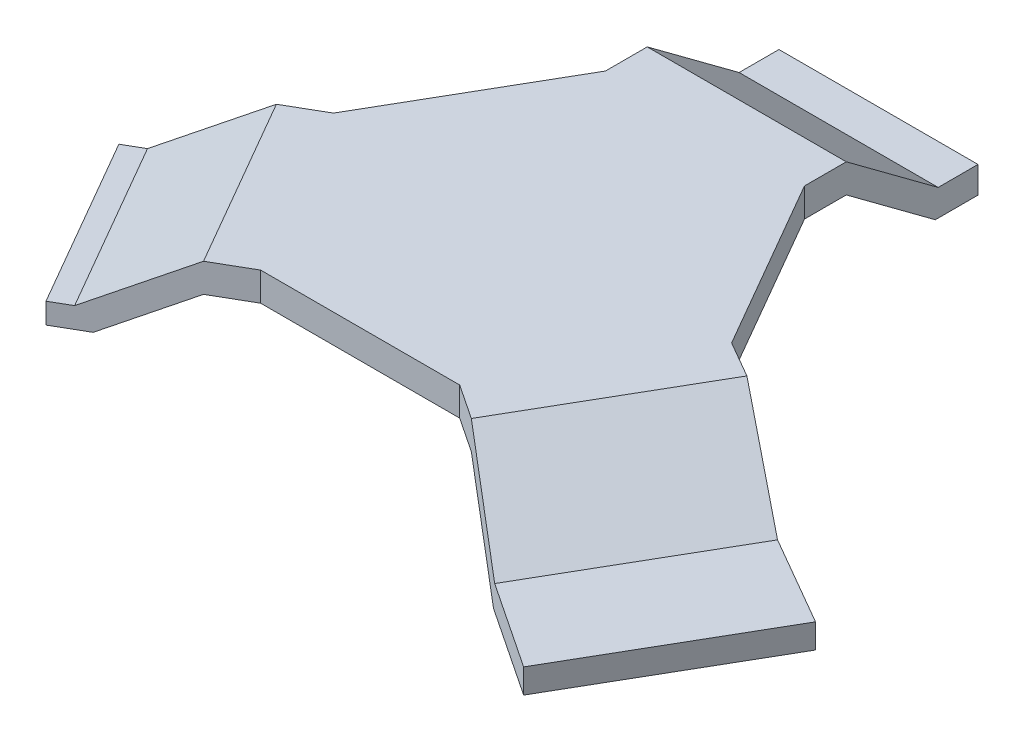
ISO-10303-21;
HEADER;
FILE_DESCRIPTION(('STEP AP214'),'2;1');
FILE_NAME('part.step','',(''),(''),'','','');
FILE_SCHEMA(('AUTOMOTIVE_DESIGN { 1 0 10303 214 1 1 1 1 }'));
ENDSEC;
DATA;
#1=APPLICATION_CONTEXT('core data for automotive mechanical design processes');
#2=APPLICATION_PROTOCOL_DEFINITION('international standard','automotive_design',2000,#1);
#3=PRODUCT_CONTEXT('',#1,'mechanical');
#4=PRODUCT('Part','Part','',(#3));
#5=PRODUCT_RELATED_PRODUCT_CATEGORY('part','',(#4));
#6=PRODUCT_DEFINITION_FORMATION('','',#4);
#7=PRODUCT_DEFINITION_CONTEXT('part definition',#1,'design');
#8=PRODUCT_DEFINITION('design','',#6,#7);
#9=PRODUCT_DEFINITION_SHAPE('','',#8);
#10=(LENGTH_UNIT() NAMED_UNIT(*) SI_UNIT(.MILLI.,.METRE.));
#11=(NAMED_UNIT(*) PLANE_ANGLE_UNIT() SI_UNIT($,.RADIAN.));
#12=(NAMED_UNIT(*) SI_UNIT($,.STERADIAN.) SOLID_ANGLE_UNIT());
#13=UNCERTAINTY_MEASURE_WITH_UNIT(LENGTH_MEASURE(1.E-05),#10,'distance_accuracy_value','');
#14=(GEOMETRIC_REPRESENTATION_CONTEXT(3) GLOBAL_UNCERTAINTY_ASSIGNED_CONTEXT((#13)) GLOBAL_UNIT_ASSIGNED_CONTEXT((#10,
#11,#12)) REPRESENTATION_CONTEXT('',''));
#15=CARTESIAN_POINT('',(0.,0.,0.));
#16=DIRECTION('',(0.,0.,1.));
#17=DIRECTION('',(1.,0.,0.));
#18=AXIS2_PLACEMENT_3D('',#15,#16,#17);
#19=CARTESIAN_POINT('',(69.3496378300734,10.,0.));
#20=DIRECTION('',(-0.500366239620644,0.,0.865813851961203));
#21=DIRECTION('',(0.865813851961203,0.,0.500366239620644));
#22=AXIS2_PLACEMENT_3D('',#19,#20,#21);
#23=PLANE('',#22);
#24=DIRECTION('',(-0.865813851961203,0.,-0.500366239620644));
#25=VECTOR('',#24,1.);
#26=CARTESIAN_POINT('',(69.3496378300734,0.,0.));
#27=LINE('',#26,#25);
#28=CARTESIAN_POINT('',(81.9647254608758,0.,7.29044002473675));
#29=VERTEX_POINT('',#28);
#30=CARTESIAN_POINT('',(69.3496378300734,0.,0.));
#31=VERTEX_POINT('',#30);
#32=EDGE_CURVE('E170',#29,#31,#27,.T.);
#33=ORIENTED_EDGE('',*,*,#32,.T.);
#34=DIRECTION('',(0.,-1.,0.));
#35=VECTOR('',#34,1.);
#36=CARTESIAN_POINT('',(69.3496378300734,10.,0.));
#37=LINE('',#36,#35);
#38=CARTESIAN_POINT('',(69.3496378300734,10.,0.));
#39=VERTEX_POINT('',#38);
#40=EDGE_CURVE('E11',#39,#31,#37,.T.);
#41=ORIENTED_EDGE('',*,*,#40,.F.);
#42=DIRECTION('',(-0.865813851961203,0.,-0.500366239620644));
#43=VECTOR('',#42,1.);
#44=CARTESIAN_POINT('',(69.3496378300734,10.,0.));
#45=LINE('',#44,#43);
#46=CARTESIAN_POINT('',(81.9647254608758,10.,7.29044002473675));
#47=VERTEX_POINT('',#46);
#48=EDGE_CURVE('E111',#47,#39,#45,.T.);
#49=ORIENTED_EDGE('',*,*,#48,.F.);
#50=DIRECTION('',(0.60896200313436,-0.710853044408382,0.351927873283608));
#51=VECTOR('',#50,1.);
#52=CARTESIAN_POINT('',(81.9647254608758,10.,7.29044002473675));
#53=LINE('',#52,#51);
#54=CARTESIAN_POINT('',(107.250161795656,-19.516175566387,21.9032562407655));
#55=VERTEX_POINT('',#54);
#56=EDGE_CURVE('E414',#47,#55,#53,.T.);
#57=ORIENTED_EDGE('',*,*,#56,.T.);
#58=DIRECTION('',(0.865813851961203,0.,0.500366239620644));
#59=VECTOR('',#58,1.);
#60=CARTESIAN_POINT('',(107.250161795656,-19.516175566387,21.9032562407655));
#61=LINE('',#60,#59);
#62=CARTESIAN_POINT('',(138.595931145093,-19.516175566387,40.0184258027519));
#63=VERTEX_POINT('',#62);
#64=EDGE_CURVE('E410',#55,#63,#61,.T.);
#65=ORIENTED_EDGE('',*,*,#64,.T.);
#66=DIRECTION('',(0.,-1.,0.));
#67=VECTOR('',#66,1.);
#68=CARTESIAN_POINT('',(138.595931145093,-19.516175566387,40.0184258027519));
#69=LINE('',#68,#67);
#70=CARTESIAN_POINT('',(138.595931145093,-28.0295430047875,40.0184258027519));
#71=VERTEX_POINT('',#70);
#72=EDGE_CURVE('E406',#63,#71,#69,.T.);
#73=ORIENTED_EDGE('',*,*,#72,.T.);
#74=DIRECTION('',(-0.865813851961203,0.,-0.500366239620644));
#75=VECTOR('',#74,1.);
#76=CARTESIAN_POINT('',(138.595931145093,-28.0295430047875,40.0184258027519));
#77=LINE('',#76,#75);
#78=CARTESIAN_POINT('',(105.976617636624,-28.0295430047875,21.1672568104003));
#79=VERTEX_POINT('',#78);
#80=EDGE_CURVE('E402',#71,#79,#77,.T.);
#81=ORIENTED_EDGE('',*,*,#80,.T.);
#82=DIRECTION('',(-0.60896200313436,0.710853044408381,-0.351927873283608));
#83=VECTOR('',#82,1.);
#84=CARTESIAN_POINT('',(105.976617636624,-28.0295430047875,21.1672568104003));
#85=LINE('',#84,#83);
#86=EDGE_CURVE('E386',#79,#29,#85,.T.);
#87=ORIENTED_EDGE('',*,*,#86,.T.);
#88=EDGE_LOOP('',(#33,#41,#49,#57,#65,#73,#81,#87));
#89=FACE_BOUND('',#88,.T.);
#90=ADVANCED_FACE('F45',(#89),#23,.F.);
#91=CARTESIAN_POINT('',(69.3496378300734,10.,0.));
#92=DIRECTION('',(-0.866025403784439,0.,0.5));
#93=DIRECTION('',(0.5,0.,0.866025403784439));
#94=AXIS2_PLACEMENT_3D('',#91,#92,#93);
#95=PLANE('',#94);
#96=DIRECTION('',(-0.5,0.,-0.866025403784438));
#97=VECTOR('',#96,1.);
#98=CARTESIAN_POINT('',(69.3496378300734,0.,0.));
#99=LINE('',#98,#97);
#100=CARTESIAN_POINT('',(34.6748189150367,0.,-60.0585481040939));
#101=VERTEX_POINT('',#100);
#102=EDGE_CURVE('E174',#31,#101,#99,.T.);
#103=ORIENTED_EDGE('',*,*,#102,.T.);
#104=DIRECTION('',(0.,-1.,0.));
#105=VECTOR('',#104,1.);
#106=CARTESIAN_POINT('',(34.6748189150367,10.,-60.0585481040939));
#107=LINE('',#106,#105);
#108=CARTESIAN_POINT('',(34.6748189150367,10.,-60.0585481040939));
#109=VERTEX_POINT('',#108);
#110=EDGE_CURVE('E54',#109,#101,#107,.T.);
#111=ORIENTED_EDGE('',*,*,#110,.F.);
#112=DIRECTION('',(-0.5,0.,-0.866025403784438));
#113=VECTOR('',#112,1.);
#114=CARTESIAN_POINT('',(69.3496378300734,10.,0.));
#115=LINE('',#114,#113);
#116=EDGE_CURVE('E350',#39,#109,#115,.T.);
#117=ORIENTED_EDGE('',*,*,#116,.F.);
#118=ORIENTED_EDGE('',*,*,#40,.T.);
#119=EDGE_LOOP('',(#103,#111,#117,#118));
#120=FACE_BOUND('',#119,.T.);
#121=ADVANCED_FACE('F448',(#120),#95,.F.);
#122=CARTESIAN_POINT('',(34.6748189150367,10.,-74.6287557789045));
#123=DIRECTION('',(-1.,0.,0.));
#124=DIRECTION('',(0.,0.,1.));
#125=AXIS2_PLACEMENT_3D('',#122,#123,#124);
#126=PLANE('',#125);
#127=DIRECTION('',(0.,0.,-1.));
#128=VECTOR('',#127,1.);
#129=CARTESIAN_POINT('',(34.6748189150367,0.,-74.6287557789045));
#130=LINE('',#129,#128);
#131=CARTESIAN_POINT('',(34.6748189150367,0.,-74.6287557789045));
#132=VERTEX_POINT('',#131);
#133=EDGE_CURVE('E177',#101,#132,#130,.T.);
#134=ORIENTED_EDGE('',*,*,#133,.T.);
#135=DIRECTION('',(0.,-0.595623408959841,-0.803263813886234));
#136=VECTOR('',#135,1.);
#137=CARTESIAN_POINT('',(34.6748189150367,-23.002237988778,-105.649808908854));
#138=LINE('',#137,#136);
#139=CARTESIAN_POINT('',(34.6748189150367,-23.002237988778,-105.649808908854));
#140=VERTEX_POINT('',#139);
#141=EDGE_CURVE('E244',#132,#140,#138,.T.);
#142=ORIENTED_EDGE('',*,*,#141,.T.);
#143=DIRECTION('',(0.,0.,-1.));
#144=VECTOR('',#143,1.);
#145=CARTESIAN_POINT('',(34.6748189150367,-23.002237988778,-120.515633105283));
#146=LINE('',#145,#144);
#147=CARTESIAN_POINT('',(34.6748189150367,-23.002237988778,-120.515633105283));
#148=VERTEX_POINT('',#147);
#149=EDGE_CURVE('E369',#140,#148,#146,.T.);
#150=ORIENTED_EDGE('',*,*,#149,.T.);
#151=DIRECTION('',(0.,1.,0.));
#152=VECTOR('',#151,1.);
#153=CARTESIAN_POINT('',(34.6748189150367,-13.7346680213121,-120.515633105283));
#154=LINE('',#153,#152);
#155=CARTESIAN_POINT('',(34.6748189150367,-13.7346680213121,-120.515633105283));
#156=VERTEX_POINT('',#155);
#157=EDGE_CURVE('E372',#148,#156,#154,.T.);
#158=ORIENTED_EDGE('',*,*,#157,.T.);
#159=DIRECTION('',(0.,0.,1.));
#160=VECTOR('',#159,1.);
#161=CARTESIAN_POINT('',(34.6748189150367,-13.7346680213121,-106.637571532834));
#162=LINE('',#161,#160);
#163=CARTESIAN_POINT('',(34.6748189150367,-13.7346680213121,-106.637571532834));
#164=VERTEX_POINT('',#163);
#165=EDGE_CURVE('E289',#156,#164,#162,.T.);
#166=ORIENTED_EDGE('',*,*,#165,.T.);
#167=DIRECTION('',(0.,0.595623408959841,0.803263813886234));
#168=VECTOR('',#167,1.);
#169=CARTESIAN_POINT('',(34.6748189150367,9.99999999999997,-74.6287557789046));
#170=LINE('',#169,#168);
#171=CARTESIAN_POINT('',(34.6748189150367,10.,-74.6287557789045));
#172=VERTEX_POINT('',#171);
#173=EDGE_CURVE('E290',#164,#172,#170,.T.);
#174=ORIENTED_EDGE('',*,*,#173,.T.);
#175=DIRECTION('',(0.,0.,-1.));
#176=VECTOR('',#175,1.);
#177=CARTESIAN_POINT('',(34.6748189150367,10.,-74.6287557789045));
#178=LINE('',#177,#176);
#179=EDGE_CURVE('E224',#109,#172,#178,.T.);
#180=ORIENTED_EDGE('',*,*,#179,.F.);
#181=ORIENTED_EDGE('',*,*,#110,.T.);
#182=EDGE_LOOP('',(#134,#142,#150,#158,#166,#174,#180,#181));
#183=FACE_BOUND('',#182,.T.);
#184=ADVANCED_FACE('F219',(#183),#126,.F.);
#185=CARTESIAN_POINT('',(-34.6748189150367,10.,-60.0585481040939));
#186=DIRECTION('',(1.,0.,0.));
#187=DIRECTION('',(0.,0.,-1.));
#188=AXIS2_PLACEMENT_3D('',#185,#186,#187);
#189=PLANE('',#188);
#190=DIRECTION('',(0.,0.,1.));
#191=VECTOR('',#190,1.);
#192=CARTESIAN_POINT('',(-34.6748189150367,0.,-60.0585481040939));
#193=LINE('',#192,#191);
#194=CARTESIAN_POINT('',(-34.6748189150368,0.,-74.6287557789045));
#195=VERTEX_POINT('',#194);
#196=CARTESIAN_POINT('',(-34.6748189150367,0.,-60.0585481040939));
#197=VERTEX_POINT('',#196);
#198=EDGE_CURVE('E185',#195,#197,#193,.T.);
#199=ORIENTED_EDGE('',*,*,#198,.T.);
#200=DIRECTION('',(0.,-1.,0.));
#201=VECTOR('',#200,1.);
#202=CARTESIAN_POINT('',(-34.6748189150367,10.,-60.0585481040939));
#203=LINE('',#202,#201);
#204=CARTESIAN_POINT('',(-34.6748189150367,10.,-60.0585481040939));
#205=VERTEX_POINT('',#204);
#206=EDGE_CURVE('E210',#205,#197,#203,.T.);
#207=ORIENTED_EDGE('',*,*,#206,.F.);
#208=DIRECTION('',(0.,0.,1.));
#209=VECTOR('',#208,1.);
#210=CARTESIAN_POINT('',(-34.6748189150367,10.,-60.0585481040939));
#211=LINE('',#210,#209);
#212=CARTESIAN_POINT('',(-34.6748189150368,10.,-74.6287557789045));
#213=VERTEX_POINT('',#212);
#214=EDGE_CURVE('E358',#213,#205,#211,.T.);
#215=ORIENTED_EDGE('',*,*,#214,.F.);
#216=DIRECTION('',(0.,-0.595623408959841,-0.803263813886234));
#217=VECTOR('',#216,1.);
#218=CARTESIAN_POINT('',(-34.6748189150368,10.,-74.6287557789045));
#219=LINE('',#218,#217);
#220=CARTESIAN_POINT('',(-34.6748189150368,-13.7346680213121,-106.637571532834));
#221=VERTEX_POINT('',#220);
#222=EDGE_CURVE('E269',#213,#221,#219,.T.);
#223=ORIENTED_EDGE('',*,*,#222,.T.);
#224=DIRECTION('',(0.,0.,-1.));
#225=VECTOR('',#224,1.);
#226=CARTESIAN_POINT('',(-34.6748189150368,-13.7346680213121,-106.637571532834));
#227=LINE('',#226,#225);
#228=CARTESIAN_POINT('',(-34.6748189150368,-13.7346680213121,-120.515633105283));
#229=VERTEX_POINT('',#228);
#230=EDGE_CURVE('E265',#221,#229,#227,.T.);
#231=ORIENTED_EDGE('',*,*,#230,.T.);
#232=DIRECTION('',(0.,-1.,0.));
#233=VECTOR('',#232,1.);
#234=CARTESIAN_POINT('',(-34.6748189150368,-13.7346680213121,-120.515633105283));
#235=LINE('',#234,#233);
#236=CARTESIAN_POINT('',(-34.6748189150368,-23.002237988778,-120.515633105283));
#237=VERTEX_POINT('',#236);
#238=EDGE_CURVE('E256',#229,#237,#235,.T.);
#239=ORIENTED_EDGE('',*,*,#238,.T.);
#240=DIRECTION('',(0.,0.,1.));
#241=VECTOR('',#240,1.);
#242=CARTESIAN_POINT('',(-34.6748189150368,-23.002237988778,-120.515633105283));
#243=LINE('',#242,#241);
#244=CARTESIAN_POINT('',(-34.6748189150368,-23.002237988778,-105.649808908854));
#245=VERTEX_POINT('',#244);
#246=EDGE_CURVE('E250',#237,#245,#243,.T.);
#247=ORIENTED_EDGE('',*,*,#246,.T.);
#248=DIRECTION('',(0.,0.595623408959841,0.803263813886234));
#249=VECTOR('',#248,1.);
#250=CARTESIAN_POINT('',(-34.6748189150368,-23.002237988778,-105.649808908854));
#251=LINE('',#250,#249);
#252=EDGE_CURVE('E242',#245,#195,#251,.T.);
#253=ORIENTED_EDGE('',*,*,#252,.T.);
#254=EDGE_LOOP('',(#199,#207,#215,#223,#231,#239,#247,#253));
#255=FACE_BOUND('',#254,.T.);
#256=ADVANCED_FACE('F246',(#255),#189,.F.);
#257=CARTESIAN_POINT('',(-34.6748189150367,10.,-60.0585481040939));
#258=DIRECTION('',(0.866025403784439,0.,0.5));
#259=DIRECTION('',(0.5,0.,-0.866025403784439));
#260=AXIS2_PLACEMENT_3D('',#257,#258,#259);
#261=PLANE('',#260);
#262=DIRECTION('',(-0.5,0.,0.866025403784439));
#263=VECTOR('',#262,1.);
#264=CARTESIAN_POINT('',(-34.6748189150367,0.,-60.0585481040939));
#265=LINE('',#264,#263);
#266=CARTESIAN_POINT('',(-69.3496378300734,0.,0.));
#267=VERTEX_POINT('',#266);
#268=EDGE_CURVE('E188',#197,#267,#265,.T.);
#269=ORIENTED_EDGE('',*,*,#268,.T.);
#270=DIRECTION('',(0.,-1.,0.));
#271=VECTOR('',#270,1.);
#272=CARTESIAN_POINT('',(-69.3496378300734,10.,0.));
#273=LINE('',#272,#271);
#274=CARTESIAN_POINT('',(-69.3496378300734,10.,0.));
#275=VERTEX_POINT('',#274);
#276=EDGE_CURVE('E156',#275,#267,#273,.T.);
#277=ORIENTED_EDGE('',*,*,#276,.F.);
#278=DIRECTION('',(-0.5,0.,0.866025403784439));
#279=VECTOR('',#278,1.);
#280=CARTESIAN_POINT('',(-34.6748189150367,10.,-60.0585481040939));
#281=LINE('',#280,#279);
#282=EDGE_CURVE('E361',#205,#275,#281,.T.);
#283=ORIENTED_EDGE('',*,*,#282,.F.);
#284=ORIENTED_EDGE('',*,*,#206,.T.);
#285=EDGE_LOOP('',(#269,#277,#283,#284));
#286=FACE_BOUND('',#285,.T.);
#287=ADVANCED_FACE('F458',(#286),#261,.F.);
#288=CARTESIAN_POINT('',(-81.9678078148744,10.,7.28510383740531));
#289=DIRECTION('',(0.5,0.,0.866025403784438));
#290=DIRECTION('',(0.866025403784438,0.,-0.5));
#291=AXIS2_PLACEMENT_3D('',#288,#289,#290);
#292=PLANE('',#291);
#293=DIRECTION('',(-0.866025403784438,0.,0.5));
#294=VECTOR('',#293,1.);
#295=CARTESIAN_POINT('',(-81.9678078148744,0.,7.28510383740531));
#296=LINE('',#295,#294);
#297=CARTESIAN_POINT('',(-81.9678078148744,0.,7.28510383740531));
#298=VERTEX_POINT('',#297);
#299=EDGE_CURVE('E191',#267,#298,#296,.T.);
#300=ORIENTED_EDGE('',*,*,#299,.T.);
#301=DIRECTION('',(-0.745804815073918,-0.508298046179677,0.430590610745846));
#302=VECTOR('',#301,1.);
#303=CARTESIAN_POINT('',(-106.339039002263,-16.6100418570175,21.355840723927));
#304=LINE('',#303,#302);
#305=CARTESIAN_POINT('',(-106.339039002263,-16.6100418570174,21.3558407239269));
#306=VERTEX_POINT('',#305);
#307=EDGE_CURVE('E307',#298,#306,#304,.T.);
#308=ORIENTED_EDGE('',*,*,#307,.T.);
#309=DIRECTION('',(-0.866025403784439,0.,0.5));
#310=VECTOR('',#309,1.);
#311=CARTESIAN_POINT('',(-116.760873398912,-16.6100418570174,27.3728896182818));
#312=LINE('',#311,#310);
#313=CARTESIAN_POINT('',(-116.760873398912,-16.6100418570174,27.3728896182817));
#314=VERTEX_POINT('',#313);
#315=EDGE_CURVE('E303',#306,#314,#312,.T.);
#316=ORIENTED_EDGE('',*,*,#315,.T.);
#317=DIRECTION('',(0.,1.,0.));
#318=VECTOR('',#317,1.);
#319=CARTESIAN_POINT('',(-116.760873398912,-9.40211629827347,27.3728896182817));
#320=LINE('',#319,#318);
#321=CARTESIAN_POINT('',(-116.760873398912,-9.40211629827347,27.3728896182817));
#322=VERTEX_POINT('',#321);
#323=EDGE_CURVE('E298',#314,#322,#320,.T.);
#324=ORIENTED_EDGE('',*,*,#323,.T.);
#325=DIRECTION('',(0.866025403784439,0.,-0.5));
#326=VECTOR('',#325,1.);
#327=CARTESIAN_POINT('',(-110.435734982081,-9.40211629827347,23.7210692506629));
#328=LINE('',#327,#326);
#329=CARTESIAN_POINT('',(-110.435734982081,-9.40211629827347,23.7210692506628));
#330=VERTEX_POINT('',#329);
#331=EDGE_CURVE('E294',#322,#330,#328,.T.);
#332=ORIENTED_EDGE('',*,*,#331,.T.);
#333=DIRECTION('',(0.745804815073918,0.508298046179678,-0.430590610745846));
#334=VECTOR('',#333,1.);
#335=CARTESIAN_POINT('',(-81.9678078148746,9.99999999999995,7.28510383740543));
#336=LINE('',#335,#334);
#337=CARTESIAN_POINT('',(-81.9678078148744,10.,7.28510383740531));
#338=VERTEX_POINT('',#337);
#339=EDGE_CURVE('E171',#330,#338,#336,.T.);
#340=ORIENTED_EDGE('',*,*,#339,.T.);
#341=DIRECTION('',(-0.866025403784438,0.,0.5));
#342=VECTOR('',#341,1.);
#343=CARTESIAN_POINT('',(-81.9678078148744,10.,7.28510383740531));
#344=LINE('',#343,#342);
#345=EDGE_CURVE('E364',#275,#338,#344,.T.);
#346=ORIENTED_EDGE('',*,*,#345,.F.);
#347=ORIENTED_EDGE('',*,*,#276,.T.);
#348=EDGE_LOOP('',(#300,#308,#316,#324,#332,#340,#346,#347));
#349=FACE_BOUND('',#348,.T.);
#350=ADVANCED_FACE('F461',(#349),#292,.F.);
#351=CARTESIAN_POINT('',(-47.2929888998376,10.,67.3436519414992));
#352=DIRECTION('',(-0.500000000000002,0.,-0.866025403784437));
#353=DIRECTION('',(-0.866025403784437,0.,0.500000000000002));
#354=AXIS2_PLACEMENT_3D('',#351,#352,#353);
#355=PLANE('',#354);
#356=DIRECTION('',(0.866025403784437,0.,-0.500000000000002));
#357=VECTOR('',#356,1.);
#358=CARTESIAN_POINT('',(-47.2929888998376,0.,67.3436519414992));
#359=LINE('',#358,#357);
#360=CARTESIAN_POINT('',(-47.2929888998376,0.,67.3436519414992));
#361=VERTEX_POINT('',#360);
#362=CARTESIAN_POINT('',(-34.6748189150367,0.,60.0585481040939));
#363=VERTEX_POINT('',#362);
#364=EDGE_CURVE('E154',#361,#363,#359,.T.);
#365=ORIENTED_EDGE('',*,*,#364,.T.);
#366=DIRECTION('',(0.,-1.,0.));
#367=VECTOR('',#366,1.);
#368=CARTESIAN_POINT('',(-34.6748189150367,10.,60.0585481040939));
#369=LINE('',#368,#367);
#370=CARTESIAN_POINT('',(-34.6748189150367,10.,60.0585481040939));
#371=VERTEX_POINT('',#370);
#372=EDGE_CURVE('E150',#371,#363,#369,.T.);
#373=ORIENTED_EDGE('',*,*,#372,.F.);
#374=DIRECTION('',(0.866025403784437,0.,-0.500000000000002));
#375=VECTOR('',#374,1.);
#376=CARTESIAN_POINT('',(-47.2929888998376,10.,67.3436519414992));
#377=LINE('',#376,#375);
#378=CARTESIAN_POINT('',(-47.2929888998376,10.,67.3436519414992));
#379=VERTEX_POINT('',#378);
#380=EDGE_CURVE('E138',#379,#371,#377,.T.);
#381=ORIENTED_EDGE('',*,*,#380,.F.);
#382=DIRECTION('',(-0.745804815073917,-0.508298046179678,0.430590610745848));
#383=VECTOR('',#382,1.);
#384=CARTESIAN_POINT('',(-47.2929888998376,10.,67.3436519414992));
#385=LINE('',#384,#383);
#386=CARTESIAN_POINT('',(-75.7609160670442,-9.40211629827347,83.7796173547568));
#387=VERTEX_POINT('',#386);
#388=EDGE_CURVE('E293',#379,#387,#385,.T.);
#389=ORIENTED_EDGE('',*,*,#388,.T.);
#390=DIRECTION('',(-0.866025403784438,0.,0.500000000000001));
#391=VECTOR('',#390,1.);
#392=CARTESIAN_POINT('',(-75.7609160670442,-9.40211629827347,83.7796173547568));
#393=LINE('',#392,#391);
#394=CARTESIAN_POINT('',(-82.086054483875,-9.40211629827347,87.4314377223756));
#395=VERTEX_POINT('',#394);
#396=EDGE_CURVE('E313',#387,#395,#393,.T.);
#397=ORIENTED_EDGE('',*,*,#396,.T.);
#398=DIRECTION('',(0.,-1.,0.));
#399=VECTOR('',#398,1.);
#400=CARTESIAN_POINT('',(-82.086054483875,-9.40211629827347,87.4314377223756));
#401=LINE('',#400,#399);
#402=CARTESIAN_POINT('',(-82.086054483875,-16.6100418570174,87.4314377223756));
#403=VERTEX_POINT('',#402);
#404=EDGE_CURVE('E317',#395,#403,#401,.T.);
#405=ORIENTED_EDGE('',*,*,#404,.T.);
#406=DIRECTION('',(0.866025403784438,0.,-0.500000000000002));
#407=VECTOR('',#406,1.);
#408=CARTESIAN_POINT('',(-82.086054483875,-16.6100418570174,87.4314377223756));
#409=LINE('',#408,#407);
#410=CARTESIAN_POINT('',(-71.6642200872263,-16.6100418570174,81.4143888280208));
#411=VERTEX_POINT('',#410);
#412=EDGE_CURVE('E321',#403,#411,#409,.T.);
#413=ORIENTED_EDGE('',*,*,#412,.T.);
#414=DIRECTION('',(0.745804815073917,0.508298046179677,-0.430590610745848));
#415=VECTOR('',#414,1.);
#416=CARTESIAN_POINT('',(-71.6642200872263,-16.6100418570174,81.4143888280208));
#417=LINE('',#416,#415);
#418=EDGE_CURVE('E325',#411,#361,#417,.T.);
#419=ORIENTED_EDGE('',*,*,#418,.T.);
#420=EDGE_LOOP('',(#365,#373,#381,#389,#397,#405,#413,#419));
#421=FACE_BOUND('',#420,.T.);
#422=ADVANCED_FACE('F151',(#421),#355,.F.);
#423=CARTESIAN_POINT('',(-34.6748189150367,10.,60.0585481040939));
#424=DIRECTION('',(0.,0.,-1.));
#425=DIRECTION('',(-1.,0.,0.));
#426=AXIS2_PLACEMENT_3D('',#423,#424,#425);
#427=PLANE('',#426);
#428=DIRECTION('',(1.,0.,0.));
#429=VECTOR('',#428,1.);
#430=CARTESIAN_POINT('',(-34.6748189150367,0.,60.0585481040939));
#431=LINE('',#430,#429);
#432=CARTESIAN_POINT('',(34.6748189150367,0.,60.0585481040939));
#433=VERTEX_POINT('',#432);
#434=EDGE_CURVE('E95',#363,#433,#431,.T.);
#435=ORIENTED_EDGE('',*,*,#434,.T.);
#436=DIRECTION('',(0.,-1.,0.));
#437=VECTOR('',#436,1.);
#438=CARTESIAN_POINT('',(34.6748189150367,10.,60.0585481040939));
#439=LINE('',#438,#437);
#440=CARTESIAN_POINT('',(34.6748189150367,10.,60.0585481040939));
#441=VERTEX_POINT('',#440);
#442=EDGE_CURVE('E157',#441,#433,#439,.T.);
#443=ORIENTED_EDGE('',*,*,#442,.F.);
#444=DIRECTION('',(1.,0.,0.));
#445=VECTOR('',#444,1.);
#446=CARTESIAN_POINT('',(-34.6748189150367,10.,60.0585481040939));
#447=LINE('',#446,#445);
#448=EDGE_CURVE('E142',#371,#441,#447,.T.);
#449=ORIENTED_EDGE('',*,*,#448,.F.);
#450=ORIENTED_EDGE('',*,*,#372,.T.);
#451=EDGE_LOOP('',(#435,#443,#449,#450));
#452=FACE_BOUND('',#451,.T.);
#453=ADVANCED_FACE('F159',(#452),#427,.F.);
#454=CARTESIAN_POINT('',(46.8021479844693,10.,68.1343664111638));
#455=DIRECTION('',(0.554269265566584,0.,-0.832337420309985));
#456=DIRECTION('',(-0.832337420309985,0.,-0.554269265566584));
#457=AXIS2_PLACEMENT_3D('',#454,#455,#456);
#458=PLANE('',#457);
#459=DIRECTION('',(0.832337420309985,0.,0.554269265566584));
#460=VECTOR('',#459,1.);
#461=CARTESIAN_POINT('',(46.8021479844693,0.,68.1343664111638));
#462=LINE('',#461,#460);
#463=CARTESIAN_POINT('',(46.8021479844693,0.,68.1343664111638));
#464=VERTEX_POINT('',#463);
#465=EDGE_CURVE('E102',#433,#464,#462,.T.);
#466=ORIENTED_EDGE('',*,*,#465,.T.);
#467=DIRECTION('',(0.586012492329374,-0.710144054284674,0.390236826809106));
#468=VECTOR('',#467,1.);
#469=CARTESIAN_POINT('',(71.9222060201541,-30.4410914286466,84.8622892206941));
#470=LINE('',#469,#468);
#471=CARTESIAN_POINT('',(69.9321907637958,-28.0295430047875,83.5371003397265));
#472=VERTEX_POINT('',#471);
#473=EDGE_CURVE('E258',#464,#472,#470,.T.);
#474=ORIENTED_EDGE('',*,*,#473,.T.);
#475=DIRECTION('',(0.832337420309985,0.,0.554269265566584));
#476=VECTOR('',#475,1.);
#477=CARTESIAN_POINT('',(105.241754006225,-28.0295430047875,107.050407813719));
#478=LINE('',#477,#476);
#479=CARTESIAN_POINT('',(101.353542790572,-28.0295430047875,104.46117426218));
#480=VERTEX_POINT('',#479);
#481=EDGE_CURVE('E419',#472,#480,#478,.T.);
#482=ORIENTED_EDGE('',*,*,#481,.T.);
#483=DIRECTION('',(0.,1.,0.));
#484=VECTOR('',#483,1.);
#485=CARTESIAN_POINT('',(101.353542790572,-19.516175566387,104.46117426218));
#486=LINE('',#485,#484);
#487=CARTESIAN_POINT('',(101.353542790572,-19.516175566387,104.46117426218));
#488=VERTEX_POINT('',#487);
#489=EDGE_CURVE('E423',#480,#488,#486,.T.);
#490=ORIENTED_EDGE('',*,*,#489,.T.);
#491=DIRECTION('',(-0.832337420309985,0.,-0.554269265566584));
#492=VECTOR('',#491,1.);
#493=CARTESIAN_POINT('',(75.168621839551,-19.516175566387,87.0241390523052));
#494=LINE('',#493,#492);
#495=CARTESIAN_POINT('',(71.1589633423235,-19.516175566387,84.3540314538707));
#496=VERTEX_POINT('',#495);
#497=EDGE_CURVE('E398',#488,#496,#494,.T.);
#498=ORIENTED_EDGE('',*,*,#497,.T.);
#499=DIRECTION('',(-0.586012492329374,0.710144054284675,-0.390236826809106));
#500=VECTOR('',#499,1.);
#501=CARTESIAN_POINT('',(48.8382790843841,7.53256728606416,69.490264706505));
#502=LINE('',#501,#500);
#503=CARTESIAN_POINT('',(46.8021479844693,10.,68.1343664111638));
#504=VERTEX_POINT('',#503);
#505=EDGE_CURVE('E252',#496,#504,#502,.T.);
#506=ORIENTED_EDGE('',*,*,#505,.T.);
#507=DIRECTION('',(0.832337420309985,0.,0.554269265566584));
#508=VECTOR('',#507,1.);
#509=CARTESIAN_POINT('',(46.8021479844693,10.,68.1343664111638));
#510=LINE('',#509,#508);
#511=EDGE_CURVE('E62',#441,#504,#510,.T.);
#512=ORIENTED_EDGE('',*,*,#511,.F.);
#513=ORIENTED_EDGE('',*,*,#442,.T.);
#514=EDGE_LOOP('',(#466,#474,#482,#490,#498,#506,#512,#513));
#515=FACE_BOUND('',#514,.T.);
#516=ADVANCED_FACE('F432',(#515),#458,.F.);
#517=CARTESIAN_POINT('',(0.,10.,0.));
#518=DIRECTION('',(0.,1.,0.));
#519=DIRECTION('',(0.,0.,1.));
#520=AXIS2_PLACEMENT_3D('',#517,#518,#519);
#521=PLANE('',#520);
#522=DIRECTION('',(0.500366239620644,0.,-0.865813851961203));
#523=VECTOR('',#522,1.);
#524=CARTESIAN_POINT('',(81.9647254608758,10.,7.29044002473675));
#525=LINE('',#524,#523);
#526=EDGE_CURVE('E204',#504,#47,#525,.T.);
#527=ORIENTED_EDGE('',*,*,#526,.T.);
#528=ORIENTED_EDGE('',*,*,#48,.T.);
#529=ORIENTED_EDGE('',*,*,#116,.T.);
#530=ORIENTED_EDGE('',*,*,#179,.T.);
#531=DIRECTION('',(-1.,0.,0.));
#532=VECTOR('',#531,1.);
#533=CARTESIAN_POINT('',(-34.6748189150368,10.,-74.6287557789045));
#534=LINE('',#533,#532);
#535=EDGE_CURVE('E355',#172,#213,#534,.T.);
#536=ORIENTED_EDGE('',*,*,#535,.T.);
#537=ORIENTED_EDGE('',*,*,#214,.T.);
#538=ORIENTED_EDGE('',*,*,#282,.T.);
#539=ORIENTED_EDGE('',*,*,#345,.T.);
#540=DIRECTION('',(0.5,0.,0.866025403784438));
#541=VECTOR('',#540,1.);
#542=CARTESIAN_POINT('',(-81.9678078148744,10.,7.28510383740531));
#543=LINE('',#542,#541);
#544=EDGE_CURVE('E144',#338,#379,#543,.T.);
#545=ORIENTED_EDGE('',*,*,#544,.T.);
#546=ORIENTED_EDGE('',*,*,#380,.T.);
#547=ORIENTED_EDGE('',*,*,#448,.T.);
#548=ORIENTED_EDGE('',*,*,#511,.T.);
#549=EDGE_LOOP('',(#527,#528,#529,#530,#536,#537,#538,#539,#545,#546,#547,#548));
#550=FACE_BOUND('',#549,.T.);
#551=ADVANCED_FACE('F140',(#550),#521,.T.);
#552=CARTESIAN_POINT('',(0.,0.,0.));
#553=DIRECTION('',(0.,1.,0.));
#554=DIRECTION('',(0.,0.,1.));
#555=AXIS2_PLACEMENT_3D('',#552,#553,#554);
#556=PLANE('',#555);
#557=DIRECTION('',(0.500366239620644,0.,-0.865813851961203));
#558=VECTOR('',#557,1.);
#559=CARTESIAN_POINT('',(81.9647254608758,0.,7.29044002473675));
#560=LINE('',#559,#558);
#561=EDGE_CURVE('E166',#464,#29,#560,.T.);
#562=ORIENTED_EDGE('',*,*,#561,.F.);
#563=ORIENTED_EDGE('',*,*,#465,.F.);
#564=ORIENTED_EDGE('',*,*,#434,.F.);
#565=ORIENTED_EDGE('',*,*,#364,.F.);
#566=DIRECTION('',(0.5,0.,0.866025403784438));
#567=VECTOR('',#566,1.);
#568=CARTESIAN_POINT('',(-81.9678078148744,0.,7.28510383740531));
#569=LINE('',#568,#567);
#570=EDGE_CURVE('E194',#298,#361,#569,.T.);
#571=ORIENTED_EDGE('',*,*,#570,.F.);
#572=ORIENTED_EDGE('',*,*,#299,.F.);
#573=ORIENTED_EDGE('',*,*,#268,.F.);
#574=ORIENTED_EDGE('',*,*,#198,.F.);
#575=DIRECTION('',(-1.,0.,0.));
#576=VECTOR('',#575,1.);
#577=CARTESIAN_POINT('',(-34.6748189150368,0.,-74.6287557789045));
#578=LINE('',#577,#576);
#579=EDGE_CURVE('E181',#132,#195,#578,.T.);
#580=ORIENTED_EDGE('',*,*,#579,.F.);
#581=ORIENTED_EDGE('',*,*,#133,.F.);
#582=ORIENTED_EDGE('',*,*,#102,.F.);
#583=ORIENTED_EDGE('',*,*,#32,.F.);
#584=EDGE_LOOP('',(#562,#563,#564,#565,#571,#572,#573,#574,#580,#581,#582,#583));
#585=FACE_BOUND('',#584,.T.);
#586=ADVANCED_FACE('F230',(#585),#556,.F.);
#587=CARTESIAN_POINT('',(-130.433493125286,-16.6100418570174,-20.3769779977852));
#588=DIRECTION('',(0.440199020685596,-0.861181221491692,-0.25414902308984));
#589=DIRECTION('',(0.890418034670561,0.455143629564796,0.));
#590=AXIS2_PLACEMENT_3D('',#587,#588,#589);
#591=PLANE('',#590);
#592=ORIENTED_EDGE('',*,*,#307,.F.);
#593=ORIENTED_EDGE('',*,*,#570,.T.);
#594=ORIENTED_EDGE('',*,*,#418,.F.);
#595=DIRECTION('',(0.500000000000002,0.,0.866025403784437));
#596=VECTOR('',#595,1.);
#597=CARTESIAN_POINT('',(-130.433493125286,-16.6100418570174,-20.3769779977852));
#598=LINE('',#597,#596);
#599=EDGE_CURVE('E299',#306,#411,#598,.T.);
#600=ORIENTED_EDGE('',*,*,#599,.F.);
#601=EDGE_LOOP('',(#592,#593,#594,#600));
#602=FACE_BOUND('',#601,.T.);
#603=ADVANCED_FACE('F474',(#602),#591,.T.);
#604=CARTESIAN_POINT('',(-140.855327521934,-16.6100418570174,-14.3599291034304));
#605=DIRECTION('',(0.,-1.,0.));
#606=DIRECTION('',(0.,0.,-1.));
#607=AXIS2_PLACEMENT_3D('',#604,#605,#606);
#608=PLANE('',#607);
#609=ORIENTED_EDGE('',*,*,#315,.F.);
#610=ORIENTED_EDGE('',*,*,#599,.T.);
#611=ORIENTED_EDGE('',*,*,#412,.F.);
#612=DIRECTION('',(0.500000000000002,0.,0.866025403784437));
#613=VECTOR('',#612,1.);
#614=CARTESIAN_POINT('',(-140.855327521934,-16.6100418570174,-14.3599291034304));
#615=LINE('',#614,#613);
#616=EDGE_CURVE('E332',#314,#403,#615,.T.);
#617=ORIENTED_EDGE('',*,*,#616,.F.);
#618=EDGE_LOOP('',(#609,#610,#611,#617));
#619=FACE_BOUND('',#618,.T.);
#620=ADVANCED_FACE('F488',(#619),#608,.T.);
#621=CARTESIAN_POINT('',(-140.855327521934,-9.40211629827347,-14.3599291034304));
#622=DIRECTION('',(-0.866025403784437,0.,0.500000000000002));
#623=DIRECTION('',(0.500000000000002,0.,0.866025403784437));
#624=AXIS2_PLACEMENT_3D('',#621,#622,#623);
#625=PLANE('',#624);
#626=ORIENTED_EDGE('',*,*,#323,.F.);
#627=ORIENTED_EDGE('',*,*,#616,.T.);
#628=ORIENTED_EDGE('',*,*,#404,.F.);
#629=DIRECTION('',(0.500000000000002,0.,0.866025403784437));
#630=VECTOR('',#629,1.);
#631=CARTESIAN_POINT('',(-140.855327521934,-9.40211629827347,-14.3599291034304));
#632=LINE('',#631,#630);
#633=EDGE_CURVE('E336',#322,#395,#632,.T.);
#634=ORIENTED_EDGE('',*,*,#633,.F.);
#635=EDGE_LOOP('',(#626,#627,#628,#634));
#636=FACE_BOUND('',#635,.T.);
#637=ADVANCED_FACE('F484',(#636),#625,.T.);
#638=CARTESIAN_POINT('',(-134.530189105104,-9.40211629827347,-18.0117494710493));
#639=DIRECTION('',(0.,1.,0.));
#640=DIRECTION('',(0.,0.,1.));
#641=AXIS2_PLACEMENT_3D('',#638,#639,#640);
#642=PLANE('',#641);
#643=ORIENTED_EDGE('',*,*,#331,.F.);
#644=ORIENTED_EDGE('',*,*,#633,.T.);
#645=ORIENTED_EDGE('',*,*,#396,.F.);
#646=DIRECTION('',(0.500000000000002,0.,0.866025403784437));
#647=VECTOR('',#646,1.);
#648=CARTESIAN_POINT('',(-134.530189105104,-9.40211629827347,-18.0117494710493));
#649=LINE('',#648,#647);
#650=EDGE_CURVE('E328',#330,#387,#649,.T.);
#651=ORIENTED_EDGE('',*,*,#650,.F.);
#652=EDGE_LOOP('',(#643,#644,#645,#651));
#653=FACE_BOUND('',#652,.T.);
#654=ADVANCED_FACE('F480',(#653),#642,.T.);
#655=CARTESIAN_POINT('',(-106.062261937897,10.,-34.4477148843068));
#656=DIRECTION('',(-0.440199020685596,0.861181221491692,0.25414902308984));
#657=DIRECTION('',(-0.89041803467056,-0.455143629564797,0.));
#658=AXIS2_PLACEMENT_3D('',#655,#656,#657);
#659=PLANE('',#658);
#660=ORIENTED_EDGE('',*,*,#339,.F.);
#661=ORIENTED_EDGE('',*,*,#650,.T.);
#662=ORIENTED_EDGE('',*,*,#388,.F.);
#663=ORIENTED_EDGE('',*,*,#544,.F.);
#664=EDGE_LOOP('',(#660,#661,#662,#663));
#665=FACE_BOUND('',#664,.T.);
#666=ADVANCED_FACE('F477',(#665),#659,.T.);
#667=CARTESIAN_POINT('',(91.19696699023,-23.002237988778,-105.649808908854));
#668=DIRECTION('',(0.,-0.803263813886234,0.595623408959841));
#669=DIRECTION('',(0.,-0.595623408959841,-0.803263813886234));
#670=AXIS2_PLACEMENT_3D('',#667,#668,#669);
#671=PLANE('',#670);
#672=ORIENTED_EDGE('',*,*,#141,.F.);
#673=ORIENTED_EDGE('',*,*,#579,.T.);
#674=ORIENTED_EDGE('',*,*,#252,.F.);
#675=DIRECTION('',(-1.,0.,0.));
#676=VECTOR('',#675,1.);
#677=CARTESIAN_POINT('',(91.19696699023,-23.002237988778,-105.649808908854));
#678=LINE('',#677,#676);
#679=EDGE_CURVE('E285',#140,#245,#678,.T.);
#680=ORIENTED_EDGE('',*,*,#679,.F.);
#681=EDGE_LOOP('',(#672,#673,#674,#680));
#682=FACE_BOUND('',#681,.T.);
#683=ADVANCED_FACE('F239',(#682),#671,.T.);
#684=CARTESIAN_POINT('',(91.19696699023,-23.002237988778,-120.515633105283));
#685=DIRECTION('',(0.,-1.,0.));
#686=DIRECTION('',(0.,0.,-1.));
#687=AXIS2_PLACEMENT_3D('',#684,#685,#686);
#688=PLANE('',#687);
#689=ORIENTED_EDGE('',*,*,#149,.F.);
#690=ORIENTED_EDGE('',*,*,#679,.T.);
#691=ORIENTED_EDGE('',*,*,#246,.F.);
#692=DIRECTION('',(-1.,0.,0.));
#693=VECTOR('',#692,1.);
#694=CARTESIAN_POINT('',(91.19696699023,-23.002237988778,-120.515633105283));
#695=LINE('',#694,#693);
#696=EDGE_CURVE('E281',#148,#237,#695,.T.);
#697=ORIENTED_EDGE('',*,*,#696,.F.);
#698=EDGE_LOOP('',(#689,#690,#691,#697));
#699=FACE_BOUND('',#698,.T.);
#700=ADVANCED_FACE('F498',(#699),#688,.T.);
#701=CARTESIAN_POINT('',(91.19696699023,-13.7346680213121,-120.515633105283));
#702=DIRECTION('',(0.,0.,-1.));
#703=DIRECTION('',(-1.,0.,0.));
#704=AXIS2_PLACEMENT_3D('',#701,#702,#703);
#705=PLANE('',#704);
#706=ORIENTED_EDGE('',*,*,#157,.F.);
#707=ORIENTED_EDGE('',*,*,#696,.T.);
#708=ORIENTED_EDGE('',*,*,#238,.F.);
#709=DIRECTION('',(-1.,0.,0.));
#710=VECTOR('',#709,1.);
#711=CARTESIAN_POINT('',(91.19696699023,-13.7346680213121,-120.515633105283));
#712=LINE('',#711,#710);
#713=EDGE_CURVE('E277',#156,#229,#712,.T.);
#714=ORIENTED_EDGE('',*,*,#713,.F.);
#715=EDGE_LOOP('',(#706,#707,#708,#714));
#716=FACE_BOUND('',#715,.T.);
#717=ADVANCED_FACE('F501',(#716),#705,.T.);
#718=CARTESIAN_POINT('',(91.19696699023,-13.7346680213121,-106.637571532834));
#719=DIRECTION('',(0.,1.,0.));
#720=DIRECTION('',(0.,0.,1.));
#721=AXIS2_PLACEMENT_3D('',#718,#719,#720);
#722=PLANE('',#721);
#723=ORIENTED_EDGE('',*,*,#165,.F.);
#724=ORIENTED_EDGE('',*,*,#713,.T.);
#725=ORIENTED_EDGE('',*,*,#230,.F.);
#726=DIRECTION('',(-1.,0.,0.));
#727=VECTOR('',#726,1.);
#728=CARTESIAN_POINT('',(91.19696699023,-13.7346680213121,-106.637571532834));
#729=LINE('',#728,#727);
#730=EDGE_CURVE('E273',#164,#221,#729,.T.);
#731=ORIENTED_EDGE('',*,*,#730,.F.);
#732=EDGE_LOOP('',(#723,#724,#725,#731));
#733=FACE_BOUND('',#732,.T.);
#734=ADVANCED_FACE('F505',(#733),#722,.T.);
#735=CARTESIAN_POINT('',(91.19696699023,10.,-74.6287557789046));
#736=DIRECTION('',(0.,0.803263813886234,-0.595623408959841));
#737=DIRECTION('',(0.,0.595623408959841,0.803263813886234));
#738=AXIS2_PLACEMENT_3D('',#735,#736,#737);
#739=PLANE('',#738);
#740=ORIENTED_EDGE('',*,*,#173,.F.);
#741=ORIENTED_EDGE('',*,*,#730,.T.);
#742=ORIENTED_EDGE('',*,*,#222,.F.);
#743=ORIENTED_EDGE('',*,*,#535,.F.);
#744=EDGE_LOOP('',(#740,#741,#742,#743));
#745=FACE_BOUND('',#744,.T.);
#746=ADVANCED_FACE('F509',(#745),#739,.T.);
#747=CARTESIAN_POINT('',(31.8781594948822,-28.0295430047875,149.384283436191));
#748=DIRECTION('',(-0.615466412557569,-0.70334056420438,-0.355686864753509));
#749=DIRECTION('',(0.752553671348314,-0.658530919350166,0.));
#750=AXIS2_PLACEMENT_3D('',#747,#748,#749);
#751=PLANE('',#750);
#752=ORIENTED_EDGE('',*,*,#473,.F.);
#753=ORIENTED_EDGE('',*,*,#561,.T.);
#754=ORIENTED_EDGE('',*,*,#86,.F.);
#755=DIRECTION('',(0.500366239620644,0.,-0.865813851961203));
#756=VECTOR('',#755,1.);
#757=CARTESIAN_POINT('',(31.8781594948822,-28.0295430047875,149.384283436191));
#758=LINE('',#757,#756);
#759=EDGE_CURVE('E394',#472,#79,#758,.T.);
#760=ORIENTED_EDGE('',*,*,#759,.F.);
#761=EDGE_LOOP('',(#752,#753,#754,#760));
#762=FACE_BOUND('',#761,.T.);
#763=ADVANCED_FACE('F513',(#762),#751,.T.);
#764=CARTESIAN_POINT('',(64.4974730033512,-28.0295430047875,168.235452428543));
#765=DIRECTION('',(0.,-1.,0.));
#766=DIRECTION('',(0.,0.,-1.));
#767=AXIS2_PLACEMENT_3D('',#764,#765,#766);
#768=PLANE('',#767);
#769=ORIENTED_EDGE('',*,*,#481,.F.);
#770=ORIENTED_EDGE('',*,*,#759,.T.);
#771=ORIENTED_EDGE('',*,*,#80,.F.);
#772=DIRECTION('',(0.500366239620644,0.,-0.865813851961203));
#773=VECTOR('',#772,1.);
#774=CARTESIAN_POINT('',(64.4974730033512,-28.0295430047875,168.235452428543));
#775=LINE('',#774,#773);
#776=EDGE_CURVE('E390',#480,#71,#775,.T.);
#777=ORIENTED_EDGE('',*,*,#776,.F.);
#778=EDGE_LOOP('',(#769,#770,#771,#777));
#779=FACE_BOUND('',#778,.T.);
#780=ADVANCED_FACE('F522',(#779),#768,.T.);
#781=CARTESIAN_POINT('',(64.4974730033512,-19.516175566387,168.235452428543));
#782=DIRECTION('',(0.865813851961203,0.,0.500366239620644));
#783=DIRECTION('',(0.500366239620644,0.,-0.865813851961203));
#784=AXIS2_PLACEMENT_3D('',#781,#782,#783);
#785=PLANE('',#784);
#786=ORIENTED_EDGE('',*,*,#489,.F.);
#787=ORIENTED_EDGE('',*,*,#776,.T.);
#788=ORIENTED_EDGE('',*,*,#72,.F.);
#789=DIRECTION('',(0.500366239620644,0.,-0.865813851961203));
#790=VECTOR('',#789,1.);
#791=CARTESIAN_POINT('',(64.4974730033512,-19.516175566387,168.235452428543));
#792=LINE('',#791,#790);
#793=EDGE_CURVE('E385',#488,#63,#792,.T.);
#794=ORIENTED_EDGE('',*,*,#793,.F.);
#795=EDGE_LOOP('',(#786,#787,#788,#794));
#796=FACE_BOUND('',#795,.T.);
#797=ADVANCED_FACE('F519',(#796),#785,.T.);
#798=CARTESIAN_POINT('',(33.1517036539142,-19.516175566387,150.120282866557));
#799=DIRECTION('',(0.,1.,0.));
#800=DIRECTION('',(-1.,0.,0.));
#801=AXIS2_PLACEMENT_3D('',#798,#799,#800);
#802=PLANE('',#801);
#803=ORIENTED_EDGE('',*,*,#497,.F.);
#804=ORIENTED_EDGE('',*,*,#793,.T.);
#805=ORIENTED_EDGE('',*,*,#64,.F.);
#806=DIRECTION('',(0.500366239620644,0.,-0.865813851961203));
#807=VECTOR('',#806,1.);
#808=CARTESIAN_POINT('',(33.1517036539142,-19.516175566387,150.120282866557));
#809=LINE('',#808,#807);
#810=EDGE_CURVE('E381',#496,#55,#809,.T.);
#811=ORIENTED_EDGE('',*,*,#810,.F.);
#812=EDGE_LOOP('',(#803,#804,#805,#811));
#813=FACE_BOUND('',#812,.T.);
#814=ADVANCED_FACE('F443',(#813),#802,.T.);
#815=CARTESIAN_POINT('',(7.86626731913444,10.,135.507466650528));
#816=DIRECTION('',(0.615466412557569,0.70334056420438,0.355686864753509));
#817=DIRECTION('',(-0.752553671348314,0.658530919350166,0.));
#818=AXIS2_PLACEMENT_3D('',#815,#816,#817);
#819=PLANE('',#818);
#820=ORIENTED_EDGE('',*,*,#505,.F.);
#821=ORIENTED_EDGE('',*,*,#810,.T.);
#822=ORIENTED_EDGE('',*,*,#56,.F.);
#823=ORIENTED_EDGE('',*,*,#526,.F.);
#824=EDGE_LOOP('',(#820,#821,#822,#823));
#825=FACE_BOUND('',#824,.T.);
#826=ADVANCED_FACE('F447',(#825),#819,.T.);
#827=CLOSED_SHELL('',(#90,#121,#184,#256,#287,#350,#422,#453,#516,#551,#586,#603,#620,#637,#654,
#666,#683,#700,#717,#734,#746,#763,#780,#797,#814,#826));
#828=MANIFOLD_SOLID_BREP('B2',#827);
#829=ADVANCED_BREP_SHAPE_REPRESENTATION('',(#18,#828),#14);
#830=SHAPE_DEFINITION_REPRESENTATION(#9,#829);
ENDSEC;
END-ISO-10303-21;
